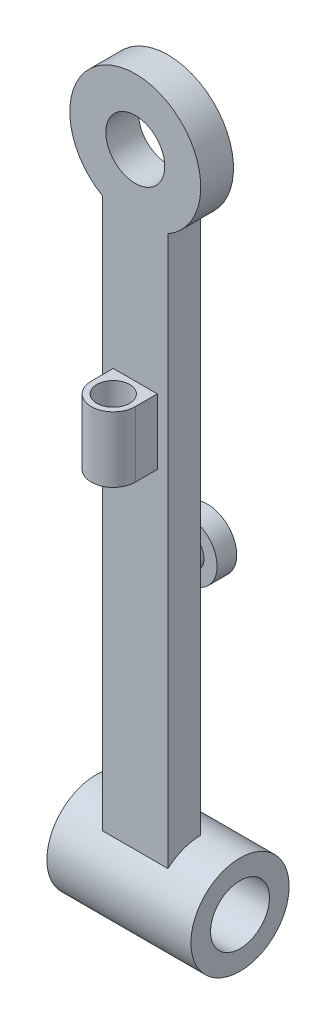
ISO-10303-21;
HEADER;
FILE_DESCRIPTION(('STEP AP214'),'2;1');
FILE_NAME('part.step','',(''),(''),'','','');
FILE_SCHEMA(('AUTOMOTIVE_DESIGN { 1 0 10303 214 1 1 1 1 }'));
ENDSEC;
DATA;
#1=APPLICATION_CONTEXT('core data for automotive mechanical design processes');
#2=APPLICATION_PROTOCOL_DEFINITION('international standard','automotive_design',2000,#1);
#3=PRODUCT_CONTEXT('',#1,'mechanical');
#4=PRODUCT('Part','Part','',(#3));
#5=PRODUCT_RELATED_PRODUCT_CATEGORY('part','',(#4));
#6=PRODUCT_DEFINITION_FORMATION('','',#4);
#7=PRODUCT_DEFINITION_CONTEXT('part definition',#1,'design');
#8=PRODUCT_DEFINITION('design','',#6,#7);
#9=PRODUCT_DEFINITION_SHAPE('','',#8);
#10=(LENGTH_UNIT() NAMED_UNIT(*) SI_UNIT(.MILLI.,.METRE.));
#11=(NAMED_UNIT(*) PLANE_ANGLE_UNIT() SI_UNIT($,.RADIAN.));
#12=(NAMED_UNIT(*) SI_UNIT($,.STERADIAN.) SOLID_ANGLE_UNIT());
#13=UNCERTAINTY_MEASURE_WITH_UNIT(LENGTH_MEASURE(1.E-05),#10,'distance_accuracy_value','');
#14=(GEOMETRIC_REPRESENTATION_CONTEXT(3) GLOBAL_UNCERTAINTY_ASSIGNED_CONTEXT((#13)) GLOBAL_UNIT_ASSIGNED_CONTEXT((#10,
#11,#12)) REPRESENTATION_CONTEXT('',''));
#15=CARTESIAN_POINT('',(0.,0.,0.));
#16=DIRECTION('',(0.,0.,1.));
#17=DIRECTION('',(1.,0.,0.));
#18=AXIS2_PLACEMENT_3D('',#15,#16,#17);
#19=CARTESIAN_POINT('',(0.,103.661508864675,5.));
#20=DIRECTION('',(0.,0.,1.));
#21=DIRECTION('',(1.,0.,0.));
#22=AXIS2_PLACEMENT_3D('',#19,#20,#21);
#23=PLANE('',#22);
#24=DIRECTION('',(0.,1.,0.));
#25=VECTOR('',#24,1.);
#26=CARTESIAN_POINT('',(3.36343010030327,63.,5.));
#27=LINE('',#26,#25);
#28=CARTESIAN_POINT('',(3.36343010030327,63.,5.));
#29=VERTEX_POINT('',#28);
#30=CARTESIAN_POINT('',(3.36343010030327,73.,5.));
#31=VERTEX_POINT('',#30);
#32=EDGE_CURVE('E174',#29,#31,#27,.T.);
#33=ORIENTED_EDGE('',*,*,#32,.F.);
#34=DIRECTION('',(-1.,0.,0.));
#35=VECTOR('',#34,1.);
#36=CARTESIAN_POINT('',(0.,63.,5.));
#37=LINE('',#36,#35);
#38=CARTESIAN_POINT('',(-3.36343010030327,63.,5.));
#39=VERTEX_POINT('',#38);
#40=EDGE_CURVE('E48',#29,#39,#37,.T.);
#41=ORIENTED_EDGE('',*,*,#40,.T.);
#42=DIRECTION('',(0.,1.,0.));
#43=VECTOR('',#42,1.);
#44=CARTESIAN_POINT('',(-3.36343010030327,63.,5.));
#45=LINE('',#44,#43);
#46=CARTESIAN_POINT('',(-3.36343010030327,73.,5.));
#47=VERTEX_POINT('',#46);
#48=EDGE_CURVE('E171',#39,#47,#45,.T.);
#49=ORIENTED_EDGE('',*,*,#48,.T.);
#50=DIRECTION('',(-1.,0.,0.));
#51=VECTOR('',#50,1.);
#52=CARTESIAN_POINT('',(0.,73.,5.));
#53=LINE('',#52,#51);
#54=EDGE_CURVE('E226',#31,#47,#53,.T.);
#55=ORIENTED_EDGE('',*,*,#54,.F.);
#56=EDGE_LOOP('',(#33,#41,#49,#55));
#57=FACE_BOUND('',#56,.T.);
#58=CARTESIAN_POINT('',(0.,103.661508864675,5.));
#59=DIRECTION('',(0.,0.,-1.));
#60=DIRECTION('',(1.,0.,0.));
#61=AXIS2_PLACEMENT_3D('',#58,#59,#60);
#62=CIRCLE('',#61,4.5);
#63=CARTESIAN_POINT('',(4.5,103.661508864675,5.));
#64=VERTEX_POINT('',#63);
#65=EDGE_CURVE('E197',#64,#64,#62,.T.);
#66=ORIENTED_EDGE('',*,*,#65,.T.);
#67=EDGE_LOOP('',(#66));
#68=FACE_BOUND('',#67,.T.);
#69=DIRECTION('',(-1.,0.,0.));
#70=VECTOR('',#69,1.);
#71=CARTESIAN_POINT('',(0.,11.0219079236566,5.));
#72=LINE('',#71,#70);
#73=CARTESIAN_POINT('',(4.99999999999999,11.0219079236566,5.));
#74=VERTEX_POINT('',#73);
#75=CARTESIAN_POINT('',(-4.99999999999999,11.0219079236566,5.));
#76=VERTEX_POINT('',#75);
#77=EDGE_CURVE('E104',#74,#76,#72,.T.);
#78=ORIENTED_EDGE('',*,*,#77,.F.);
#79=DIRECTION('',(0.,-1.,0.));
#80=VECTOR('',#79,1.);
#81=CARTESIAN_POINT('',(5.,95.,5.));
#82=LINE('',#81,#80);
#83=CARTESIAN_POINT('',(5.,95.,5.));
#84=VERTEX_POINT('',#83);
#85=EDGE_CURVE('E106',#84,#74,#82,.T.);
#86=ORIENTED_EDGE('',*,*,#85,.F.);
#87=CARTESIAN_POINT('',(0.,103.661508864675,5.));
#88=DIRECTION('',(0.,0.,1.));
#89=DIRECTION('',(1.,0.,0.));
#90=AXIS2_PLACEMENT_3D('',#87,#88,#89);
#91=CIRCLE('',#90,10.0010867315926);
#92=CARTESIAN_POINT('',(-5.,95.,5.));
#93=VERTEX_POINT('',#92);
#94=EDGE_CURVE('E201',#84,#93,#91,.T.);
#95=ORIENTED_EDGE('',*,*,#94,.T.);
#96=DIRECTION('',(0.,-1.,0.));
#97=VECTOR('',#96,1.);
#98=CARTESIAN_POINT('',(-5.,95.,5.));
#99=LINE('',#98,#97);
#100=EDGE_CURVE('E108',#93,#76,#99,.T.);
#101=ORIENTED_EDGE('',*,*,#100,.T.);
#102=EDGE_LOOP('',(#78,#86,#95,#101));
#103=FACE_BOUND('',#102,.T.);
#104=ADVANCED_FACE('F39',(#57,#68,#103),#23,.T.);
#105=CARTESIAN_POINT('',(0.,103.661508864675,0.));
#106=DIRECTION('',(0.,0.,1.));
#107=DIRECTION('',(1.,0.,0.));
#108=AXIS2_PLACEMENT_3D('',#105,#106,#107);
#109=PLANE('',#108);
#110=CARTESIAN_POINT('',(0.,46.751317941435,0.));
#111=DIRECTION('',(0.,0.,1.));
#112=DIRECTION('',(1.,0.,0.));
#113=AXIS2_PLACEMENT_3D('',#110,#111,#112);
#114=CIRCLE('',#113,2.5);
#115=CARTESIAN_POINT('',(2.5,46.751317941435,0.));
#116=VERTEX_POINT('',#115);
#117=EDGE_CURVE('E222',#116,#116,#114,.F.);
#118=ORIENTED_EDGE('',*,*,#117,.F.);
#119=EDGE_LOOP('',(#118));
#120=FACE_BOUND('',#119,.T.);
#121=CARTESIAN_POINT('',(0.,103.661508864675,0.));
#122=DIRECTION('',(0.,0.,-1.));
#123=DIRECTION('',(1.,0.,0.));
#124=AXIS2_PLACEMENT_3D('',#121,#122,#123);
#125=CIRCLE('',#124,4.5);
#126=CARTESIAN_POINT('',(4.5,103.661508864675,0.));
#127=VERTEX_POINT('',#126);
#128=EDGE_CURVE('E111',#127,#127,#125,.T.);
#129=ORIENTED_EDGE('',*,*,#128,.F.);
#130=EDGE_LOOP('',(#129));
#131=FACE_BOUND('',#130,.T.);
#132=DIRECTION('',(0.,-1.,0.));
#133=VECTOR('',#132,1.);
#134=CARTESIAN_POINT('',(5.,95.,0.));
#135=LINE('',#134,#133);
#136=CARTESIAN_POINT('',(5.,95.,0.));
#137=VERTEX_POINT('',#136);
#138=CARTESIAN_POINT('',(4.99999999999999,12.9317379799071,0.));
#139=VERTEX_POINT('',#138);
#140=EDGE_CURVE('E124',#137,#139,#135,.T.);
#141=ORIENTED_EDGE('',*,*,#140,.T.);
#142=DIRECTION('',(-1.,0.,0.));
#143=VECTOR('',#142,1.);
#144=CARTESIAN_POINT('',(0.,12.9317379799071,0.));
#145=LINE('',#144,#143);
#146=CARTESIAN_POINT('',(-5.,12.9317379799071,0.));
#147=VERTEX_POINT('',#146);
#148=EDGE_CURVE('E55',#139,#147,#145,.T.);
#149=ORIENTED_EDGE('',*,*,#148,.T.);
#150=DIRECTION('',(0.,-1.,0.));
#151=VECTOR('',#150,1.);
#152=CARTESIAN_POINT('',(-5.,95.,0.));
#153=LINE('',#152,#151);
#154=CARTESIAN_POINT('',(-5.,95.,0.));
#155=VERTEX_POINT('',#154);
#156=EDGE_CURVE('E202',#155,#147,#153,.T.);
#157=ORIENTED_EDGE('',*,*,#156,.F.);
#158=CARTESIAN_POINT('',(0.,103.661508864675,0.));
#159=DIRECTION('',(0.,0.,1.));
#160=DIRECTION('',(1.,0.,0.));
#161=AXIS2_PLACEMENT_3D('',#158,#159,#160);
#162=CIRCLE('',#161,10.0010867315926);
#163=EDGE_CURVE('E211',#137,#155,#162,.T.);
#164=ORIENTED_EDGE('',*,*,#163,.F.);
#165=EDGE_LOOP('',(#141,#149,#157,#164));
#166=FACE_BOUND('',#165,.T.);
#167=ADVANCED_FACE('F249',(#120,#131,#166),#109,.F.);
#168=CARTESIAN_POINT('',(0.,103.661508864675,5.));
#169=DIRECTION('',(0.,0.,-1.));
#170=DIRECTION('',(-1.,0.,0.));
#171=AXIS2_PLACEMENT_3D('',#168,#169,#170);
#172=CYLINDRICAL_SURFACE('',#171,4.5);
#173=ORIENTED_EDGE('',*,*,#128,.T.);
#174=EDGE_LOOP('',(#173));
#175=FACE_BOUND('',#174,.T.);
#176=ORIENTED_EDGE('',*,*,#65,.F.);
#177=EDGE_LOOP('',(#176));
#178=FACE_BOUND('',#177,.T.);
#179=ADVANCED_FACE('F41',(#175,#178),#172,.F.);
#180=CARTESIAN_POINT('',(0.,103.661508864675,5.));
#181=DIRECTION('',(0.,0.,-1.));
#182=DIRECTION('',(-1.,0.,0.));
#183=AXIS2_PLACEMENT_3D('',#180,#181,#182);
#184=CYLINDRICAL_SURFACE('',#183,10.0010867315926);
#185=ORIENTED_EDGE('',*,*,#163,.T.);
#186=DIRECTION('',(0.,0.,-1.));
#187=VECTOR('',#186,1.);
#188=CARTESIAN_POINT('',(-5.,95.,5.));
#189=LINE('',#188,#187);
#190=EDGE_CURVE('E207',#93,#155,#189,.T.);
#191=ORIENTED_EDGE('',*,*,#190,.F.);
#192=ORIENTED_EDGE('',*,*,#94,.F.);
#193=DIRECTION('',(0.,0.,-1.));
#194=VECTOR('',#193,1.);
#195=CARTESIAN_POINT('',(5.,95.,5.));
#196=LINE('',#195,#194);
#197=EDGE_CURVE('E122',#84,#137,#196,.T.);
#198=ORIENTED_EDGE('',*,*,#197,.T.);
#199=EDGE_LOOP('',(#185,#191,#192,#198));
#200=FACE_BOUND('',#199,.T.);
#201=ADVANCED_FACE('F254',(#200),#184,.T.);
#202=CARTESIAN_POINT('',(-5.,95.,5.));
#203=DIRECTION('',(1.,0.,0.));
#204=DIRECTION('',(0.,1.,0.));
#205=AXIS2_PLACEMENT_3D('',#202,#203,#204);
#206=PLANE('',#205);
#207=ORIENTED_EDGE('',*,*,#156,.T.);
#208=CARTESIAN_POINT('',(-4.99999999999999,5.4317379799071,0.));
#209=DIRECTION('',(1.,0.,0.));
#210=DIRECTION('',(0.,1.,0.));
#211=AXIS2_PLACEMENT_3D('',#208,#209,#210);
#212=CIRCLE('',#211,7.5);
#213=EDGE_CURVE('E112',#147,#76,#212,.T.);
#214=ORIENTED_EDGE('',*,*,#213,.T.);
#215=ORIENTED_EDGE('',*,*,#100,.F.);
#216=ORIENTED_EDGE('',*,*,#190,.T.);
#217=EDGE_LOOP('',(#207,#214,#215,#216));
#218=FACE_BOUND('',#217,.T.);
#219=ADVANCED_FACE('F260',(#218),#206,.F.);
#220=CARTESIAN_POINT('',(0.,5.4317379799071,0.));
#221=DIRECTION('',(-1.,0.,0.));
#222=DIRECTION('',(0.,-1.,0.));
#223=AXIS2_PLACEMENT_3D('',#220,#221,#222);
#224=CYLINDRICAL_SURFACE('',#223,7.5);
#225=ORIENTED_EDGE('',*,*,#148,.F.);
#226=CARTESIAN_POINT('',(4.99999999999999,5.4317379799071,0.));
#227=DIRECTION('',(1.,0.,0.));
#228=DIRECTION('',(0.,1.,0.));
#229=AXIS2_PLACEMENT_3D('',#226,#227,#228);
#230=CIRCLE('',#229,7.5);
#231=EDGE_CURVE('E11',#74,#139,#230,.F.);
#232=ORIENTED_EDGE('',*,*,#231,.F.);
#233=ORIENTED_EDGE('',*,*,#77,.T.);
#234=ORIENTED_EDGE('',*,*,#213,.F.);
#235=EDGE_LOOP('',(#225,#232,#233,#234));
#236=FACE_BOUND('',#235,.T.);
#237=CARTESIAN_POINT('',(-11.,5.4317379799071,0.));
#238=DIRECTION('',(-1.,0.,0.));
#239=DIRECTION('',(0.,-1.,0.));
#240=AXIS2_PLACEMENT_3D('',#237,#238,#239);
#241=CIRCLE('',#240,7.5);
#242=CARTESIAN_POINT('',(-11.,-2.0682620200929,0.));
#243=VERTEX_POINT('',#242);
#244=EDGE_CURVE('E191',#243,#243,#241,.T.);
#245=ORIENTED_EDGE('',*,*,#244,.F.);
#246=EDGE_LOOP('',(#245));
#247=FACE_BOUND('',#246,.T.);
#248=CARTESIAN_POINT('',(11.,5.4317379799071,0.));
#249=DIRECTION('',(-1.,0.,0.));
#250=DIRECTION('',(0.,-1.,0.));
#251=AXIS2_PLACEMENT_3D('',#248,#249,#250);
#252=CIRCLE('',#251,7.5);
#253=CARTESIAN_POINT('',(11.,-2.0682620200929,0.));
#254=VERTEX_POINT('',#253);
#255=EDGE_CURVE('E130',#254,#254,#252,.T.);
#256=ORIENTED_EDGE('',*,*,#255,.T.);
#257=EDGE_LOOP('',(#256));
#258=FACE_BOUND('',#257,.T.);
#259=ADVANCED_FACE('F114',(#236,#247,#258),#224,.T.);
#260=CARTESIAN_POINT('',(-11.,5.4317379799071,0.));
#261=DIRECTION('',(-1.,0.,0.));
#262=DIRECTION('',(0.,-1.,0.));
#263=AXIS2_PLACEMENT_3D('',#260,#261,#262);
#264=PLANE('',#263);
#265=CARTESIAN_POINT('',(-11.,5.4317379799071,0.));
#266=DIRECTION('',(-1.,0.,0.));
#267=DIRECTION('',(0.,-1.,0.));
#268=AXIS2_PLACEMENT_3D('',#265,#266,#267);
#269=CIRCLE('',#268,4.5);
#270=CARTESIAN_POINT('',(-11.,0.931737979907098,0.));
#271=VERTEX_POINT('',#270);
#272=EDGE_CURVE('E329',#271,#271,#269,.T.);
#273=ORIENTED_EDGE('',*,*,#272,.F.);
#274=EDGE_LOOP('',(#273));
#275=FACE_BOUND('',#274,.T.);
#276=ORIENTED_EDGE('',*,*,#244,.T.);
#277=EDGE_LOOP('',(#276));
#278=FACE_BOUND('',#277,.T.);
#279=ADVANCED_FACE('F275',(#275,#278),#264,.T.);
#280=CARTESIAN_POINT('',(0.,46.751317941435,-3.));
#281=DIRECTION('',(0.,0.,1.));
#282=DIRECTION('',(1.,0.,0.));
#283=AXIS2_PLACEMENT_3D('',#280,#281,#282);
#284=CYLINDRICAL_SURFACE('',#283,2.5);
#285=CARTESIAN_POINT('',(0.,46.751317941435,-3.));
#286=DIRECTION('',(0.,0.,-1.));
#287=DIRECTION('',(-1.,0.,0.));
#288=AXIS2_PLACEMENT_3D('',#285,#286,#287);
#289=CIRCLE('',#288,2.5);
#290=CARTESIAN_POINT('',(-2.5,46.751317941435,-3.));
#291=VERTEX_POINT('',#290);
#292=EDGE_CURVE('E184',#291,#291,#289,.T.);
#293=ORIENTED_EDGE('',*,*,#292,.F.);
#294=EDGE_LOOP('',(#293));
#295=FACE_BOUND('',#294,.T.);
#296=ORIENTED_EDGE('',*,*,#117,.T.);
#297=EDGE_LOOP('',(#296));
#298=FACE_BOUND('',#297,.T.);
#299=ADVANCED_FACE('F280',(#295,#298),#284,.T.);
#300=CARTESIAN_POINT('',(0.,46.751317941435,-6.));
#301=DIRECTION('',(0.,0.,1.));
#302=DIRECTION('',(1.,0.,0.));
#303=AXIS2_PLACEMENT_3D('',#300,#301,#302);
#304=CYLINDRICAL_SURFACE('',#303,4.5);
#305=CARTESIAN_POINT('',(0.,46.751317941435,-6.));
#306=DIRECTION('',(0.,0.,-1.));
#307=DIRECTION('',(-1.,0.,0.));
#308=AXIS2_PLACEMENT_3D('',#305,#306,#307);
#309=CIRCLE('',#308,4.5);
#310=CARTESIAN_POINT('',(-4.5,46.751317941435,-6.));
#311=VERTEX_POINT('',#310);
#312=EDGE_CURVE('E180',#311,#311,#309,.T.);
#313=ORIENTED_EDGE('',*,*,#312,.F.);
#314=EDGE_LOOP('',(#313));
#315=FACE_BOUND('',#314,.T.);
#316=CARTESIAN_POINT('',(0.,46.751317941435,-3.));
#317=DIRECTION('',(0.,0.,-1.));
#318=DIRECTION('',(-1.,0.,0.));
#319=AXIS2_PLACEMENT_3D('',#316,#317,#318);
#320=CIRCLE('',#319,4.5);
#321=CARTESIAN_POINT('',(-4.5,46.751317941435,-3.));
#322=VERTEX_POINT('',#321);
#323=EDGE_CURVE('E170',#322,#322,#320,.T.);
#324=ORIENTED_EDGE('',*,*,#323,.T.);
#325=EDGE_LOOP('',(#324));
#326=FACE_BOUND('',#325,.T.);
#327=ADVANCED_FACE('F284',(#315,#326),#304,.T.);
#328=CARTESIAN_POINT('',(0.,46.751317941435,-6.));
#329=DIRECTION('',(0.,0.,-1.));
#330=DIRECTION('',(-1.,0.,0.));
#331=AXIS2_PLACEMENT_3D('',#328,#329,#330);
#332=PLANE('',#331);
#333=ORIENTED_EDGE('',*,*,#312,.T.);
#334=EDGE_LOOP('',(#333));
#335=FACE_BOUND('',#334,.T.);
#336=ADVANCED_FACE('F288',(#335),#332,.T.);
#337=CARTESIAN_POINT('',(0.,46.751317941435,-3.));
#338=DIRECTION('',(0.,0.,-1.));
#339=DIRECTION('',(-1.,0.,0.));
#340=AXIS2_PLACEMENT_3D('',#337,#338,#339);
#341=PLANE('',#340);
#342=ORIENTED_EDGE('',*,*,#292,.T.);
#343=EDGE_LOOP('',(#342));
#344=FACE_BOUND('',#343,.T.);
#345=ORIENTED_EDGE('',*,*,#323,.F.);
#346=EDGE_LOOP('',(#345));
#347=FACE_BOUND('',#346,.T.);
#348=ADVANCED_FACE('F290',(#344,#347),#341,.F.);
#349=CARTESIAN_POINT('',(0.,63.,8.36343010030327));
#350=DIRECTION('',(0.,1.,0.));
#351=DIRECTION('',(0.,0.,1.));
#352=AXIS2_PLACEMENT_3D('',#349,#350,#351);
#353=CYLINDRICAL_SURFACE('',#352,3.36343010030327);
#354=DIRECTION('',(0.,1.,0.));
#355=VECTOR('',#354,1.);
#356=CARTESIAN_POINT('',(3.36343010030327,63.,8.36343010030327));
#357=LINE('',#356,#355);
#358=CARTESIAN_POINT('',(3.36343010030327,63.,8.36343010030327));
#359=VERTEX_POINT('',#358);
#360=CARTESIAN_POINT('',(3.36343010030327,73.,8.36343010030327));
#361=VERTEX_POINT('',#360);
#362=EDGE_CURVE('E166',#359,#361,#357,.T.);
#363=ORIENTED_EDGE('',*,*,#362,.T.);
#364=CARTESIAN_POINT('',(0.,73.,8.36343010030327));
#365=DIRECTION('',(0.,1.,0.));
#366=DIRECTION('',(0.,0.,1.));
#367=AXIS2_PLACEMENT_3D('',#364,#365,#366);
#368=CIRCLE('',#367,3.36343010030327);
#369=CARTESIAN_POINT('',(-3.36343010030327,73.,8.36343010030327));
#370=VERTEX_POINT('',#369);
#371=EDGE_CURVE('E138',#370,#361,#368,.T.);
#372=ORIENTED_EDGE('',*,*,#371,.F.);
#373=DIRECTION('',(0.,1.,0.));
#374=VECTOR('',#373,1.);
#375=CARTESIAN_POINT('',(-3.36343010030327,63.,8.36343010030327));
#376=LINE('',#375,#374);
#377=CARTESIAN_POINT('',(-3.36343010030327,63.,8.36343010030327));
#378=VERTEX_POINT('',#377);
#379=EDGE_CURVE('E167',#378,#370,#376,.T.);
#380=ORIENTED_EDGE('',*,*,#379,.F.);
#381=CARTESIAN_POINT('',(0.,63.,8.36343010030327));
#382=DIRECTION('',(0.,1.,0.));
#383=DIRECTION('',(0.,0.,1.));
#384=AXIS2_PLACEMENT_3D('',#381,#382,#383);
#385=CIRCLE('',#384,3.36343010030327);
#386=EDGE_CURVE('E154',#378,#359,#385,.T.);
#387=ORIENTED_EDGE('',*,*,#386,.T.);
#388=EDGE_LOOP('',(#363,#372,#380,#387));
#389=FACE_BOUND('',#388,.T.);
#390=ADVANCED_FACE('F241',(#389),#353,.T.);
#391=CARTESIAN_POINT('',(-3.36343010030327,63.,8.36343010030327));
#392=DIRECTION('',(-1.,0.,0.));
#393=DIRECTION('',(0.,0.,1.));
#394=AXIS2_PLACEMENT_3D('',#391,#392,#393);
#395=PLANE('',#394);
#396=ORIENTED_EDGE('',*,*,#379,.T.);
#397=DIRECTION('',(0.,0.,1.));
#398=VECTOR('',#397,1.);
#399=CARTESIAN_POINT('',(-3.36343010030327,73.,8.36343010030327));
#400=LINE('',#399,#398);
#401=EDGE_CURVE('E146',#47,#370,#400,.T.);
#402=ORIENTED_EDGE('',*,*,#401,.F.);
#403=ORIENTED_EDGE('',*,*,#48,.F.);
#404=DIRECTION('',(0.,0.,1.));
#405=VECTOR('',#404,1.);
#406=CARTESIAN_POINT('',(-3.36343010030327,63.,8.36343010030327));
#407=LINE('',#406,#405);
#408=EDGE_CURVE('E162',#39,#378,#407,.T.);
#409=ORIENTED_EDGE('',*,*,#408,.T.);
#410=EDGE_LOOP('',(#396,#402,#403,#409));
#411=FACE_BOUND('',#410,.T.);
#412=ADVANCED_FACE('F237',(#411),#395,.T.);
#413=CARTESIAN_POINT('',(3.36343010030327,63.,8.36343010030327));
#414=DIRECTION('',(1.,0.,0.));
#415=DIRECTION('',(0.,0.,-1.));
#416=AXIS2_PLACEMENT_3D('',#413,#414,#415);
#417=PLANE('',#416);
#418=ORIENTED_EDGE('',*,*,#32,.T.);
#419=DIRECTION('',(0.,0.,-1.));
#420=VECTOR('',#419,1.);
#421=CARTESIAN_POINT('',(3.36343010030327,73.,8.36343010030327));
#422=LINE('',#421,#420);
#423=EDGE_CURVE('E142',#361,#31,#422,.T.);
#424=ORIENTED_EDGE('',*,*,#423,.F.);
#425=ORIENTED_EDGE('',*,*,#362,.F.);
#426=DIRECTION('',(0.,0.,-1.));
#427=VECTOR('',#426,1.);
#428=CARTESIAN_POINT('',(3.36343010030327,63.,8.36343010030327));
#429=LINE('',#428,#427);
#430=EDGE_CURVE('E158',#359,#29,#429,.T.);
#431=ORIENTED_EDGE('',*,*,#430,.T.);
#432=EDGE_LOOP('',(#418,#424,#425,#431));
#433=FACE_BOUND('',#432,.T.);
#434=ADVANCED_FACE('F246',(#433),#417,.T.);
#435=CARTESIAN_POINT('',(0.,63.,8.36343010030327));
#436=DIRECTION('',(0.,1.,0.));
#437=DIRECTION('',(0.,0.,1.));
#438=AXIS2_PLACEMENT_3D('',#435,#436,#437);
#439=PLANE('',#438);
#440=CARTESIAN_POINT('',(0.,63.,8.36343010030327));
#441=DIRECTION('',(0.,1.,0.));
#442=DIRECTION('',(0.,0.,1.));
#443=AXIS2_PLACEMENT_3D('',#440,#441,#442);
#444=CIRCLE('',#443,2.5);
#445=CARTESIAN_POINT('',(0.,63.,10.8634301003033));
#446=VERTEX_POINT('',#445);
#447=EDGE_CURVE('E150',#446,#446,#444,.T.);
#448=ORIENTED_EDGE('',*,*,#447,.T.);
#449=EDGE_LOOP('',(#448));
#450=FACE_BOUND('',#449,.T.);
#451=ORIENTED_EDGE('',*,*,#386,.F.);
#452=ORIENTED_EDGE('',*,*,#408,.F.);
#453=ORIENTED_EDGE('',*,*,#40,.F.);
#454=ORIENTED_EDGE('',*,*,#430,.F.);
#455=EDGE_LOOP('',(#451,#452,#453,#454));
#456=FACE_BOUND('',#455,.T.);
#457=ADVANCED_FACE('F244',(#450,#456),#439,.F.);
#458=CARTESIAN_POINT('',(0.,63.,8.36343010030327));
#459=DIRECTION('',(0.,1.,0.));
#460=DIRECTION('',(0.,0.,1.));
#461=AXIS2_PLACEMENT_3D('',#458,#459,#460);
#462=CYLINDRICAL_SURFACE('',#461,2.5);
#463=ORIENTED_EDGE('',*,*,#447,.F.);
#464=EDGE_LOOP('',(#463));
#465=FACE_BOUND('',#464,.T.);
#466=CARTESIAN_POINT('',(0.,73.,8.36343010030327));
#467=DIRECTION('',(0.,1.,0.));
#468=DIRECTION('',(0.,0.,1.));
#469=AXIS2_PLACEMENT_3D('',#466,#467,#468);
#470=CIRCLE('',#469,2.5);
#471=CARTESIAN_POINT('',(0.,73.,10.8634301003033));
#472=VERTEX_POINT('',#471);
#473=EDGE_CURVE('E128',#472,#472,#470,.T.);
#474=ORIENTED_EDGE('',*,*,#473,.T.);
#475=EDGE_LOOP('',(#474));
#476=FACE_BOUND('',#475,.T.);
#477=ADVANCED_FACE('F305',(#465,#476),#462,.F.);
#478=CARTESIAN_POINT('',(0.,73.,8.36343010030327));
#479=DIRECTION('',(0.,1.,0.));
#480=DIRECTION('',(0.,0.,1.));
#481=AXIS2_PLACEMENT_3D('',#478,#479,#480);
#482=PLANE('',#481);
#483=ORIENTED_EDGE('',*,*,#371,.T.);
#484=ORIENTED_EDGE('',*,*,#423,.T.);
#485=ORIENTED_EDGE('',*,*,#54,.T.);
#486=ORIENTED_EDGE('',*,*,#401,.T.);
#487=EDGE_LOOP('',(#483,#484,#485,#486));
#488=FACE_BOUND('',#487,.T.);
#489=ORIENTED_EDGE('',*,*,#473,.F.);
#490=EDGE_LOOP('',(#489));
#491=FACE_BOUND('',#490,.T.);
#492=ADVANCED_FACE('F232',(#488,#491),#482,.T.);
#493=CARTESIAN_POINT('',(5.,95.,5.));
#494=DIRECTION('',(1.,0.,0.));
#495=DIRECTION('',(0.,1.,0.));
#496=AXIS2_PLACEMENT_3D('',#493,#494,#495);
#497=PLANE('',#496);
#498=ORIENTED_EDGE('',*,*,#85,.T.);
#499=ORIENTED_EDGE('',*,*,#231,.T.);
#500=ORIENTED_EDGE('',*,*,#140,.F.);
#501=ORIENTED_EDGE('',*,*,#197,.F.);
#502=EDGE_LOOP('',(#498,#499,#500,#501));
#503=FACE_BOUND('',#502,.T.);
#504=ADVANCED_FACE('F120',(#503),#497,.T.);
#505=CARTESIAN_POINT('',(11.,5.4317379799071,0.));
#506=DIRECTION('',(1.,0.,0.));
#507=DIRECTION('',(0.,-1.,0.));
#508=AXIS2_PLACEMENT_3D('',#505,#506,#507);
#509=PLANE('',#508);
#510=CARTESIAN_POINT('',(11.,5.4317379799071,0.));
#511=DIRECTION('',(-1.,0.,0.));
#512=DIRECTION('',(0.,-1.,0.));
#513=AXIS2_PLACEMENT_3D('',#510,#511,#512);
#514=CIRCLE('',#513,4.5);
#515=CARTESIAN_POINT('',(11.,0.9317379799071,0.));
#516=VERTEX_POINT('',#515);
#517=EDGE_CURVE('E326',#516,#516,#514,.T.);
#518=ORIENTED_EDGE('',*,*,#517,.T.);
#519=EDGE_LOOP('',(#518));
#520=FACE_BOUND('',#519,.T.);
#521=ORIENTED_EDGE('',*,*,#255,.F.);
#522=EDGE_LOOP('',(#521));
#523=FACE_BOUND('',#522,.T.);
#524=ADVANCED_FACE('F314',(#520,#523),#509,.T.);
#525=CARTESIAN_POINT('',(11.,5.4317379799071,0.));
#526=DIRECTION('',(-1.,0.,0.));
#527=DIRECTION('',(0.,-1.,0.));
#528=AXIS2_PLACEMENT_3D('',#525,#526,#527);
#529=CYLINDRICAL_SURFACE('',#528,4.5);
#530=ORIENTED_EDGE('',*,*,#517,.F.);
#531=EDGE_LOOP('',(#530));
#532=FACE_BOUND('',#531,.T.);
#533=ORIENTED_EDGE('',*,*,#272,.T.);
#534=EDGE_LOOP('',(#533));
#535=FACE_BOUND('',#534,.T.);
#536=ADVANCED_FACE('F317',(#532,#535),#529,.F.);
#537=CLOSED_SHELL('',(#104,#167,#179,#201,#219,#259,#279,#299,#327,#336,#348,#390,#412,#434,
#457,#477,#492,#504,#524,#536));
#538=MANIFOLD_SOLID_BREP('B2',#537);
#539=ADVANCED_BREP_SHAPE_REPRESENTATION('',(#18,#538),#14);
#540=SHAPE_DEFINITION_REPRESENTATION(#9,#539);
ENDSEC;
END-ISO-10303-21;
